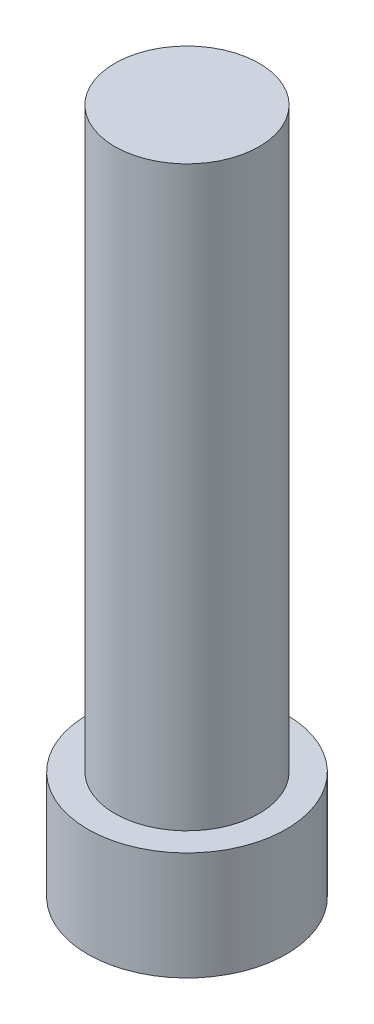
ISO-10303-21;
HEADER;
FILE_DESCRIPTION(('STEP AP214'),'2;1');
FILE_NAME('part.step','',(''),(''),'','','');
FILE_SCHEMA(('AUTOMOTIVE_DESIGN { 1 0 10303 214 1 1 1 1 }'));
ENDSEC;
DATA;
#1=APPLICATION_CONTEXT('core data for automotive mechanical design processes');
#2=APPLICATION_PROTOCOL_DEFINITION('international standard','automotive_design',2000,#1);
#3=PRODUCT_CONTEXT('',#1,'mechanical');
#4=PRODUCT('Part','Part','',(#3));
#5=PRODUCT_RELATED_PRODUCT_CATEGORY('part','',(#4));
#6=PRODUCT_DEFINITION_FORMATION('','',#4);
#7=PRODUCT_DEFINITION_CONTEXT('part definition',#1,'design');
#8=PRODUCT_DEFINITION('design','',#6,#7);
#9=PRODUCT_DEFINITION_SHAPE('','',#8);
#10=(LENGTH_UNIT() NAMED_UNIT(*) SI_UNIT(.MILLI.,.METRE.));
#11=(NAMED_UNIT(*) PLANE_ANGLE_UNIT() SI_UNIT($,.RADIAN.));
#12=(NAMED_UNIT(*) SI_UNIT($,.STERADIAN.) SOLID_ANGLE_UNIT());
#13=UNCERTAINTY_MEASURE_WITH_UNIT(LENGTH_MEASURE(1.E-05),#10,'distance_accuracy_value','');
#14=(GEOMETRIC_REPRESENTATION_CONTEXT(3) GLOBAL_UNCERTAINTY_ASSIGNED_CONTEXT((#13)) GLOBAL_UNIT_ASSIGNED_CONTEXT((#10,
#11,#12)) REPRESENTATION_CONTEXT('',''));
#15=CARTESIAN_POINT('',(0.,0.,0.));
#16=DIRECTION('',(0.,0.,1.));
#17=DIRECTION('',(1.,0.,0.));
#18=AXIS2_PLACEMENT_3D('',#15,#16,#17);
#19=CARTESIAN_POINT('',(0.,3.,0.));
#20=DIRECTION('',(0.,-1.,0.));
#21=DIRECTION('',(0.,0.,-1.));
#22=AXIS2_PLACEMENT_3D('',#19,#20,#21);
#23=CYLINDRICAL_SURFACE('',#22,2.75);
#24=CARTESIAN_POINT('',(0.,3.,0.));
#25=DIRECTION('',(0.,1.,0.));
#26=DIRECTION('',(0.,0.,1.));
#27=AXIS2_PLACEMENT_3D('',#24,#25,#26);
#28=CIRCLE('',#27,2.75);
#29=CARTESIAN_POINT('',(0.,3.,2.75));
#30=VERTEX_POINT('',#29);
#31=EDGE_CURVE('E51',#30,#30,#28,.T.);
#32=ORIENTED_EDGE('',*,*,#31,.F.);
#33=EDGE_LOOP('',(#32));
#34=FACE_BOUND('',#33,.T.);
#35=CARTESIAN_POINT('',(0.,0.,0.));
#36=DIRECTION('',(0.,1.,0.));
#37=DIRECTION('',(0.,0.,1.));
#38=AXIS2_PLACEMENT_3D('',#35,#36,#37);
#39=CIRCLE('',#38,2.75);
#40=CARTESIAN_POINT('',(0.,0.,2.75));
#41=VERTEX_POINT('',#40);
#42=EDGE_CURVE('E46',#41,#41,#39,.T.);
#43=ORIENTED_EDGE('',*,*,#42,.T.);
#44=EDGE_LOOP('',(#43));
#45=FACE_BOUND('',#44,.T.);
#46=ADVANCED_FACE('F43',(#34,#45),#23,.T.);
#47=CARTESIAN_POINT('',(0.,3.,0.));
#48=DIRECTION('',(0.,1.,0.));
#49=DIRECTION('',(0.,0.,1.));
#50=AXIS2_PLACEMENT_3D('',#47,#48,#49);
#51=PLANE('',#50);
#52=CARTESIAN_POINT('',(0.,3.,0.));
#53=DIRECTION('',(0.,1.,0.));
#54=DIRECTION('',(0.,0.,1.));
#55=AXIS2_PLACEMENT_3D('',#52,#53,#54);
#56=CIRCLE('',#55,2.);
#57=CARTESIAN_POINT('',(0.,3.,2.));
#58=VERTEX_POINT('',#57);
#59=EDGE_CURVE('E11',#58,#58,#56,.T.);
#60=ORIENTED_EDGE('',*,*,#59,.F.);
#61=EDGE_LOOP('',(#60));
#62=FACE_BOUND('',#61,.T.);
#63=ORIENTED_EDGE('',*,*,#31,.T.);
#64=EDGE_LOOP('',(#63));
#65=FACE_BOUND('',#64,.T.);
#66=ADVANCED_FACE('F162',(#62,#65),#51,.T.);
#67=CARTESIAN_POINT('',(0.,0.,0.));
#68=DIRECTION('',(0.,1.,0.));
#69=DIRECTION('',(0.,0.,1.));
#70=AXIS2_PLACEMENT_3D('',#67,#68,#69);
#71=PLANE('',#70);
#72=DIRECTION('',(0.188366587976478,0.,0.982098787563705));
#73=VECTOR('',#72,1.);
#74=CARTESIAN_POINT('',(1.09168160911144,0.,-0.944226984183985));
#75=LINE('',#74,#73);
#76=CARTESIAN_POINT('',(1.09168160911144,0.,-0.944226984183985));
#77=VERTEX_POINT('',#76);
#78=CARTESIAN_POINT('',(1.36356535979782,0.,0.47331051424279));
#79=VERTEX_POINT('',#78);
#80=EDGE_CURVE('E135',#77,#79,#75,.T.);
#81=ORIENTED_EDGE('',*,*,#80,.F.);
#82=DIRECTION('',(0.944705793044304,0.,0.327919143370027));
#83=VECTOR('',#82,1.);
#84=CARTESIAN_POINT('',(-0.271883750686377,0.,-1.41753749842678));
#85=LINE('',#84,#83);
#86=CARTESIAN_POINT('',(-0.271883750686377,0.,-1.41753749842678));
#87=VERTEX_POINT('',#86);
#88=EDGE_CURVE('E56',#87,#77,#85,.T.);
#89=ORIENTED_EDGE('',*,*,#88,.F.);
#90=DIRECTION('',(0.756339205067827,0.,-0.654179644193679));
#91=VECTOR('',#90,1.);
#92=CARTESIAN_POINT('',(-1.36356535979782,0.,-0.473310514242791));
#93=LINE('',#92,#91);
#94=CARTESIAN_POINT('',(-1.36356535979782,0.,-0.473310514242791));
#95=VERTEX_POINT('',#94);
#96=EDGE_CURVE('E142',#95,#87,#93,.T.);
#97=ORIENTED_EDGE('',*,*,#96,.F.);
#98=DIRECTION('',(-0.188366587976478,0.,-0.982098787563705));
#99=VECTOR('',#98,1.);
#100=CARTESIAN_POINT('',(-1.09168160911144,0.,0.944226984183986));
#101=LINE('',#100,#99);
#102=CARTESIAN_POINT('',(-1.09168160911144,0.,0.944226984183986));
#103=VERTEX_POINT('',#102);
#104=EDGE_CURVE('E140',#103,#95,#101,.T.);
#105=ORIENTED_EDGE('',*,*,#104,.F.);
#106=DIRECTION('',(-0.944705793044304,0.,-0.327919143370026));
#107=VECTOR('',#106,1.);
#108=CARTESIAN_POINT('',(0.271883750686377,0.,1.41753749842678));
#109=LINE('',#108,#107);
#110=CARTESIAN_POINT('',(0.271883750686377,0.,1.41753749842678));
#111=VERTEX_POINT('',#110);
#112=EDGE_CURVE('E110',#111,#103,#109,.T.);
#113=ORIENTED_EDGE('',*,*,#112,.F.);
#114=DIRECTION('',(-0.756339205067827,0.,0.654179644193679));
#115=VECTOR('',#114,1.);
#116=CARTESIAN_POINT('',(1.36356535979782,0.,0.47331051424279));
#117=LINE('',#116,#115);
#118=EDGE_CURVE('E136',#79,#111,#117,.T.);
#119=ORIENTED_EDGE('',*,*,#118,.F.);
#120=EDGE_LOOP('',(#81,#89,#97,#105,#113,#119));
#121=FACE_BOUND('',#120,.T.);
#122=ORIENTED_EDGE('',*,*,#42,.F.);
#123=EDGE_LOOP('',(#122));
#124=FACE_BOUND('',#123,.T.);
#125=ADVANCED_FACE('F159',(#121,#124),#71,.F.);
#126=CARTESIAN_POINT('',(0.,19.,0.));
#127=DIRECTION('',(0.,-1.,0.));
#128=DIRECTION('',(0.,0.,-1.));
#129=AXIS2_PLACEMENT_3D('',#126,#127,#128);
#130=CYLINDRICAL_SURFACE('',#129,2.);
#131=CARTESIAN_POINT('',(0.,19.,0.));
#132=DIRECTION('',(0.,1.,0.));
#133=DIRECTION('',(0.,0.,1.));
#134=AXIS2_PLACEMENT_3D('',#131,#132,#133);
#135=CIRCLE('',#134,2.);
#136=CARTESIAN_POINT('',(0.,19.,2.));
#137=VERTEX_POINT('',#136);
#138=EDGE_CURVE('E148',#137,#137,#135,.T.);
#139=ORIENTED_EDGE('',*,*,#138,.F.);
#140=EDGE_LOOP('',(#139));
#141=FACE_BOUND('',#140,.T.);
#142=ORIENTED_EDGE('',*,*,#59,.T.);
#143=EDGE_LOOP('',(#142));
#144=FACE_BOUND('',#143,.T.);
#145=ADVANCED_FACE('F165',(#141,#144),#130,.T.);
#146=CARTESIAN_POINT('',(0.,19.,0.));
#147=DIRECTION('',(0.,1.,0.));
#148=DIRECTION('',(0.,0.,1.));
#149=AXIS2_PLACEMENT_3D('',#146,#147,#148);
#150=PLANE('',#149);
#151=ORIENTED_EDGE('',*,*,#138,.T.);
#152=EDGE_LOOP('',(#151));
#153=FACE_BOUND('',#152,.T.);
#154=ADVANCED_FACE('F168',(#153),#150,.T.);
#155=CARTESIAN_POINT('',(-0.271883750686377,1.5,-1.41753749842678));
#156=DIRECTION('',(0.327919143370027,0.,-0.944705793044304));
#157=DIRECTION('',(-0.944705793044304,0.,-0.327919143370027));
#158=AXIS2_PLACEMENT_3D('',#155,#156,#157);
#159=PLANE('',#158);
#160=ORIENTED_EDGE('',*,*,#88,.T.);
#161=DIRECTION('',(0.,-1.,0.));
#162=VECTOR('',#161,1.);
#163=CARTESIAN_POINT('',(1.09168160911144,1.5,-0.944226984183985));
#164=LINE('',#163,#162);
#165=CARTESIAN_POINT('',(1.09168160911144,1.5,-0.944226984183985));
#166=VERTEX_POINT('',#165);
#167=EDGE_CURVE('E90',#166,#77,#164,.T.);
#168=ORIENTED_EDGE('',*,*,#167,.F.);
#169=DIRECTION('',(0.944705793044304,0.,0.327919143370027));
#170=VECTOR('',#169,1.);
#171=CARTESIAN_POINT('',(-0.271883750686377,1.5,-1.41753749842678));
#172=LINE('',#171,#170);
#173=CARTESIAN_POINT('',(-0.271883750686377,1.5,-1.41753749842678));
#174=VERTEX_POINT('',#173);
#175=EDGE_CURVE('E145',#174,#166,#172,.T.);
#176=ORIENTED_EDGE('',*,*,#175,.F.);
#177=DIRECTION('',(0.,-1.,0.));
#178=VECTOR('',#177,1.);
#179=CARTESIAN_POINT('',(-0.271883750686377,1.5,-1.41753749842678));
#180=LINE('',#179,#178);
#181=EDGE_CURVE('E67',#174,#87,#180,.T.);
#182=ORIENTED_EDGE('',*,*,#181,.T.);
#183=EDGE_LOOP('',(#160,#168,#176,#182));
#184=FACE_BOUND('',#183,.T.);
#185=ADVANCED_FACE('F196',(#184),#159,.F.);
#186=CARTESIAN_POINT('',(-1.36356535979782,1.5,-0.473310514242791));
#187=DIRECTION('',(-0.654179644193679,0.,-0.756339205067826));
#188=DIRECTION('',(-0.756339205067827,0.,0.654179644193679));
#189=AXIS2_PLACEMENT_3D('',#186,#187,#188);
#190=PLANE('',#189);
#191=ORIENTED_EDGE('',*,*,#96,.T.);
#192=ORIENTED_EDGE('',*,*,#181,.F.);
#193=DIRECTION('',(0.756339205067827,0.,-0.654179644193679));
#194=VECTOR('',#193,1.);
#195=CARTESIAN_POINT('',(-1.36356535979782,1.5,-0.473310514242791));
#196=LINE('',#195,#194);
#197=CARTESIAN_POINT('',(-1.36356535979782,1.5,-0.473310514242791));
#198=VERTEX_POINT('',#197);
#199=EDGE_CURVE('E116',#198,#174,#196,.T.);
#200=ORIENTED_EDGE('',*,*,#199,.F.);
#201=DIRECTION('',(0.,-1.,0.));
#202=VECTOR('',#201,1.);
#203=CARTESIAN_POINT('',(-1.36356535979782,1.5,-0.473310514242791));
#204=LINE('',#203,#202);
#205=EDGE_CURVE('E112',#198,#95,#204,.T.);
#206=ORIENTED_EDGE('',*,*,#205,.T.);
#207=EDGE_LOOP('',(#191,#192,#200,#206));
#208=FACE_BOUND('',#207,.T.);
#209=ADVANCED_FACE('F209',(#208),#190,.F.);
#210=CARTESIAN_POINT('',(-1.09168160911144,1.5,0.944226984183986));
#211=DIRECTION('',(-0.982098787563705,0.,0.188366587976478));
#212=DIRECTION('',(0.188366587976478,0.,0.982098787563705));
#213=AXIS2_PLACEMENT_3D('',#210,#211,#212);
#214=PLANE('',#213);
#215=ORIENTED_EDGE('',*,*,#104,.T.);
#216=ORIENTED_EDGE('',*,*,#205,.F.);
#217=DIRECTION('',(-0.188366587976478,0.,-0.982098787563705));
#218=VECTOR('',#217,1.);
#219=CARTESIAN_POINT('',(-1.09168160911144,1.5,0.944226984183986));
#220=LINE('',#219,#218);
#221=CARTESIAN_POINT('',(-1.09168160911144,1.5,0.944226984183986));
#222=VERTEX_POINT('',#221);
#223=EDGE_CURVE('E113',#222,#198,#220,.T.);
#224=ORIENTED_EDGE('',*,*,#223,.F.);
#225=DIRECTION('',(0.,-1.,0.));
#226=VECTOR('',#225,1.);
#227=CARTESIAN_POINT('',(-1.09168160911144,1.5,0.944226984183986));
#228=LINE('',#227,#226);
#229=EDGE_CURVE('E99',#222,#103,#228,.T.);
#230=ORIENTED_EDGE('',*,*,#229,.T.);
#231=EDGE_LOOP('',(#215,#216,#224,#230));
#232=FACE_BOUND('',#231,.T.);
#233=ADVANCED_FACE('F117',(#232),#214,.F.);
#234=CARTESIAN_POINT('',(0.271883750686377,1.5,1.41753749842678));
#235=DIRECTION('',(-0.327919143370026,0.,0.944705793044304));
#236=DIRECTION('',(0.944705793044304,0.,0.327919143370026));
#237=AXIS2_PLACEMENT_3D('',#234,#235,#236);
#238=PLANE('',#237);
#239=ORIENTED_EDGE('',*,*,#112,.T.);
#240=ORIENTED_EDGE('',*,*,#229,.F.);
#241=DIRECTION('',(-0.944705793044304,0.,-0.327919143370026));
#242=VECTOR('',#241,1.);
#243=CARTESIAN_POINT('',(0.271883750686377,1.5,1.41753749842678));
#244=LINE('',#243,#242);
#245=CARTESIAN_POINT('',(0.271883750686377,1.5,1.41753749842678));
#246=VERTEX_POINT('',#245);
#247=EDGE_CURVE('E102',#246,#222,#244,.T.);
#248=ORIENTED_EDGE('',*,*,#247,.F.);
#249=DIRECTION('',(0.,-1.,0.));
#250=VECTOR('',#249,1.);
#251=CARTESIAN_POINT('',(0.271883750686377,1.5,1.41753749842678));
#252=LINE('',#251,#250);
#253=EDGE_CURVE('E115',#246,#111,#252,.T.);
#254=ORIENTED_EDGE('',*,*,#253,.T.);
#255=EDGE_LOOP('',(#239,#240,#248,#254));
#256=FACE_BOUND('',#255,.T.);
#257=ADVANCED_FACE('F105',(#256),#238,.F.);
#258=CARTESIAN_POINT('',(1.36356535979782,1.5,0.47331051424279));
#259=DIRECTION('',(0.654179644193679,0.,0.756339205067826));
#260=DIRECTION('',(0.756339205067827,0.,-0.654179644193679));
#261=AXIS2_PLACEMENT_3D('',#258,#259,#260);
#262=PLANE('',#261);
#263=ORIENTED_EDGE('',*,*,#118,.T.);
#264=ORIENTED_EDGE('',*,*,#253,.F.);
#265=DIRECTION('',(-0.756339205067827,0.,0.654179644193679));
#266=VECTOR('',#265,1.);
#267=CARTESIAN_POINT('',(1.36356535979782,1.5,0.47331051424279));
#268=LINE('',#267,#266);
#269=CARTESIAN_POINT('',(1.36356535979782,1.5,0.47331051424279));
#270=VERTEX_POINT('',#269);
#271=EDGE_CURVE('E125',#270,#246,#268,.T.);
#272=ORIENTED_EDGE('',*,*,#271,.F.);
#273=DIRECTION('',(0.,-1.,0.));
#274=VECTOR('',#273,1.);
#275=CARTESIAN_POINT('',(1.36356535979782,1.5,0.47331051424279));
#276=LINE('',#275,#274);
#277=EDGE_CURVE('E149',#270,#79,#276,.T.);
#278=ORIENTED_EDGE('',*,*,#277,.T.);
#279=EDGE_LOOP('',(#263,#264,#272,#278));
#280=FACE_BOUND('',#279,.T.);
#281=ADVANCED_FACE('F235',(#280),#262,.F.);
#282=CARTESIAN_POINT('',(1.09168160911144,1.5,-0.944226984183985));
#283=DIRECTION('',(0.982098787563705,0.,-0.188366587976477));
#284=DIRECTION('',(-0.188366587976477,0.,-0.982098787563705));
#285=AXIS2_PLACEMENT_3D('',#282,#283,#284);
#286=PLANE('',#285);
#287=ORIENTED_EDGE('',*,*,#80,.T.);
#288=ORIENTED_EDGE('',*,*,#277,.F.);
#289=DIRECTION('',(0.188366587976478,0.,0.982098787563705));
#290=VECTOR('',#289,1.);
#291=CARTESIAN_POINT('',(1.09168160911144,1.5,-0.944226984183985));
#292=LINE('',#291,#290);
#293=EDGE_CURVE('E130',#166,#270,#292,.T.);
#294=ORIENTED_EDGE('',*,*,#293,.F.);
#295=ORIENTED_EDGE('',*,*,#167,.T.);
#296=EDGE_LOOP('',(#287,#288,#294,#295));
#297=FACE_BOUND('',#296,.T.);
#298=ADVANCED_FACE('F241',(#297),#286,.F.);
#299=CARTESIAN_POINT('',(0.,1.5,0.));
#300=DIRECTION('',(0.,-1.,0.));
#301=DIRECTION('',(0.,0.,-1.));
#302=AXIS2_PLACEMENT_3D('',#299,#300,#301);
#303=PLANE('',#302);
#304=ORIENTED_EDGE('',*,*,#175,.T.);
#305=ORIENTED_EDGE('',*,*,#293,.T.);
#306=ORIENTED_EDGE('',*,*,#271,.T.);
#307=ORIENTED_EDGE('',*,*,#247,.T.);
#308=ORIENTED_EDGE('',*,*,#223,.T.);
#309=ORIENTED_EDGE('',*,*,#199,.T.);
#310=EDGE_LOOP('',(#304,#305,#306,#307,#308,#309));
#311=FACE_BOUND('',#310,.T.);
#312=ADVANCED_FACE('F122',(#311),#303,.T.);
#313=CLOSED_SHELL('',(#46,#66,#125,#145,#154,#185,#209,#233,#257,#281,#298,#312));
#314=MANIFOLD_SOLID_BREP('B2',#313);
#315=ADVANCED_BREP_SHAPE_REPRESENTATION('',(#18,#314),#14);
#316=SHAPE_DEFINITION_REPRESENTATION(#9,#315);
ENDSEC;
END-ISO-10303-21;
